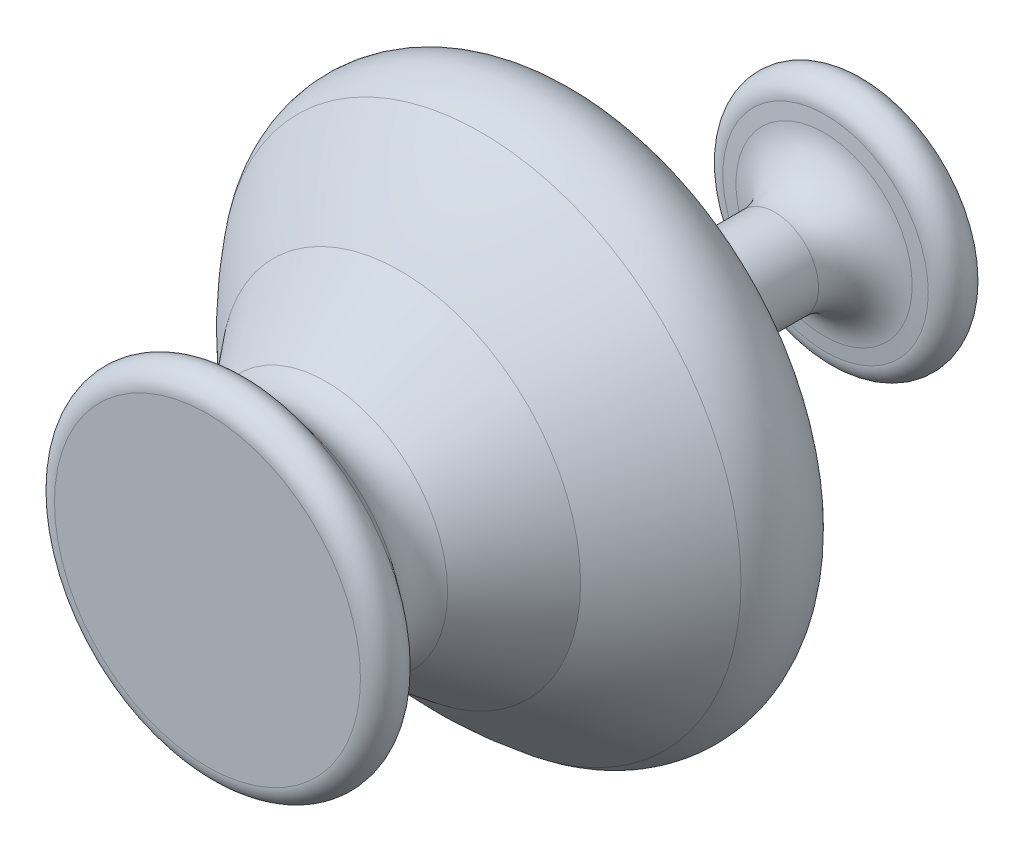
ISO-10303-21;
HEADER;
FILE_DESCRIPTION(('STEP AP214'),'2;1');
FILE_NAME('part.step','',(''),(''),'','','');
FILE_SCHEMA(('AUTOMOTIVE_DESIGN { 1 0 10303 214 1 1 1 1 }'));
ENDSEC;
DATA;
#1=APPLICATION_CONTEXT('core data for automotive mechanical design processes');
#2=APPLICATION_PROTOCOL_DEFINITION('international standard','automotive_design',2000,#1);
#3=PRODUCT_CONTEXT('',#1,'mechanical');
#4=PRODUCT('Part','Part','',(#3));
#5=PRODUCT_RELATED_PRODUCT_CATEGORY('part','',(#4));
#6=PRODUCT_DEFINITION_FORMATION('','',#4);
#7=PRODUCT_DEFINITION_CONTEXT('part definition',#1,'design');
#8=PRODUCT_DEFINITION('design','',#6,#7);
#9=PRODUCT_DEFINITION_SHAPE('','',#8);
#10=(LENGTH_UNIT() NAMED_UNIT(*) SI_UNIT(.MILLI.,.METRE.));
#11=(NAMED_UNIT(*) PLANE_ANGLE_UNIT() SI_UNIT($,.RADIAN.));
#12=(NAMED_UNIT(*) SI_UNIT($,.STERADIAN.) SOLID_ANGLE_UNIT());
#13=UNCERTAINTY_MEASURE_WITH_UNIT(LENGTH_MEASURE(1.E-05),#10,'distance_accuracy_value','');
#14=(GEOMETRIC_REPRESENTATION_CONTEXT(3) GLOBAL_UNCERTAINTY_ASSIGNED_CONTEXT((#13)) GLOBAL_UNIT_ASSIGNED_CONTEXT((#10,
#11,#12)) REPRESENTATION_CONTEXT('',''));
#15=CARTESIAN_POINT('',(0.,0.,0.));
#16=DIRECTION('',(0.,0.,1.));
#17=DIRECTION('',(1.,0.,0.));
#18=AXIS2_PLACEMENT_3D('',#15,#16,#17);
#19=CARTESIAN_POINT('',(0.,0.,-4.4));
#20=DIRECTION('',(0.,0.,1.));
#21=DIRECTION('',(1.,0.,0.));
#22=AXIS2_PLACEMENT_3D('',#19,#20,#21);
#23=PLANE('',#22);
#24=CARTESIAN_POINT('',(0.,0.,-4.4));
#25=DIRECTION('',(0.,0.,1.));
#26=DIRECTION('',(1.,0.,0.));
#27=AXIS2_PLACEMENT_3D('',#24,#25,#26);
#28=CIRCLE('',#27,37.1291959826111);
#29=CARTESIAN_POINT('',(37.1291959826111,0.,-4.4));
#30=VERTEX_POINT('',#29);
#31=EDGE_CURVE('E10',#30,#30,#28,.T.);
#32=ORIENTED_EDGE('',*,*,#31,.F.);
#33=EDGE_LOOP('',(#32));
#34=FACE_BOUND('',#33,.T.);
#35=ADVANCED_FACE('F40',(#34),#23,.F.);
#36=CARTESIAN_POINT('',(0.,0.,-5.));
#37=DIRECTION('',(0.,0.,1.));
#38=DIRECTION('',(1.,0.,0.));
#39=AXIS2_PLACEMENT_3D('',#36,#37,#38);
#40=TOROIDAL_SURFACE('',#39,37.1291959826111,0.599999999999999);
#41=CARTESIAN_POINT('',(0.,0.,-5.47199825214167));
#42=DIRECTION('',(0.,0.,1.));
#43=DIRECTION('',(1.,0.,0.));
#44=AXIS2_PLACEMENT_3D('',#41,#42,#43);
#45=CIRCLE('',#44,37.499624990621);
#46=CARTESIAN_POINT('',(37.499624990621,0.,-5.47199825214167));
#47=VERTEX_POINT('',#46);
#48=EDGE_CURVE('E43',#47,#47,#45,.T.);
#49=ORIENTED_EDGE('',*,*,#48,.F.);
#50=EDGE_LOOP('',(#49));
#51=FACE_BOUND('',#50,.T.);
#52=ORIENTED_EDGE('',*,*,#31,.T.);
#53=EDGE_LOOP('',(#52));
#54=FACE_BOUND('',#53,.T.);
#55=ADVANCED_FACE('F284',(#51,#54),#40,.F.);
#56=CARTESIAN_POINT('',(0.,0.,-5.47199825214167));
#57=DIRECTION('',(0.,0.,1.));
#58=DIRECTION('',(1.,0.,0.));
#59=AXIS2_PLACEMENT_3D('',#56,#57,#58);
#60=CONICAL_SURFACE('',#59,37.499624990621,0.905386373473802);
#61=CARTESIAN_POINT('',(0.,0.,-12.6822443641457));
#62=DIRECTION('',(0.,0.,1.));
#63=DIRECTION('',(1.,0.,0.));
#64=AXIS2_PLACEMENT_3D('',#61,#62,#63);
#65=CIRCLE('',#64,28.3123759124224);
#66=CARTESIAN_POINT('',(28.3123759124224,0.,-12.6822443641457));
#67=VERTEX_POINT('',#66);
#68=EDGE_CURVE('E50',#67,#67,#65,.T.);
#69=ORIENTED_EDGE('',*,*,#68,.F.);
#70=EDGE_LOOP('',(#69));
#71=FACE_BOUND('',#70,.T.);
#72=ORIENTED_EDGE('',*,*,#48,.T.);
#73=EDGE_LOOP('',(#72));
#74=FACE_BOUND('',#73,.T.);
#75=ADVANCED_FACE('F277',(#71,#74),#60,.F.);
#76=CARTESIAN_POINT('',(0.,0.,-23.2235386619763));
#77=DIRECTION('',(0.,0.,1.));
#78=DIRECTION('',(1.,0.,0.));
#79=AXIS2_PLACEMENT_3D('',#76,#77,#78);
#80=TOROIDAL_SURFACE('',#79,36.5852904246438,13.4);
#81=CARTESIAN_POINT('',(0.,0.,-31.4964531741977));
#82=DIRECTION('',(0.,0.,1.));
#83=DIRECTION('',(1.,0.,0.));
#84=AXIS2_PLACEMENT_3D('',#81,#82,#83);
#85=CIRCLE('',#84,26.0439961268133);
#86=CARTESIAN_POINT('',(26.0439961268133,0.,-31.4964531741977));
#87=VERTEX_POINT('',#86);
#88=EDGE_CURVE('E51',#87,#87,#85,.T.);
#89=ORIENTED_EDGE('',*,*,#88,.F.);
#90=EDGE_LOOP('',(#89));
#91=FACE_BOUND('',#90,.T.);
#92=ORIENTED_EDGE('',*,*,#68,.T.);
#93=EDGE_LOOP('',(#92));
#94=FACE_BOUND('',#93,.T.);
#95=ADVANCED_FACE('F275',(#91,#94),#80,.T.);
#96=CARTESIAN_POINT('',(0.,0.,-31.4964531741977));
#97=DIRECTION('',(0.,0.,-1.));
#98=DIRECTION('',(-1.,0.,0.));
#99=AXIS2_PLACEMENT_3D('',#96,#97,#98);
#100=CONICAL_SURFACE('',#99,26.0439961268133,0.665409953321095);
#101=CARTESIAN_POINT('',(0.,0.,-49.974021950315));
#102=DIRECTION('',(0.,0.,1.));
#103=DIRECTION('',(1.,0.,0.));
#104=AXIS2_PLACEMENT_3D('',#101,#102,#103);
#105=CIRCLE('',#104,40.5453792169307);
#106=CARTESIAN_POINT('',(40.5453792169307,0.,-49.974021950315));
#107=VERTEX_POINT('',#106);
#108=EDGE_CURVE('E57',#107,#107,#105,.T.);
#109=ORIENTED_EDGE('',*,*,#108,.F.);
#110=EDGE_LOOP('',(#109));
#111=FACE_BOUND('',#110,.T.);
#112=ORIENTED_EDGE('',*,*,#88,.T.);
#113=EDGE_LOOP('',(#112));
#114=FACE_BOUND('',#113,.T.);
#115=ADVANCED_FACE('F266',(#111,#114),#100,.F.);
#116=CARTESIAN_POINT('',(0.,0.,-143.897984235247));
#117=DIRECTION('',(0.,0.,1.));
#118=DIRECTION('',(1.,0.,0.));
#119=AXIS2_PLACEMENT_3D('',#116,#117,#118);
#120=DEGENERATE_TOROIDAL_SURFACE('',#119,34.7835614944496,120.4,.F.);
#121=CARTESIAN_POINT('',(0.,0.,-69.1516395343863));
#122=DIRECTION('',(0.,0.,1.));
#123=DIRECTION('',(1.,0.,0.));
#124=AXIS2_PLACEMENT_3D('',#121,#122,#123);
#125=CIRCLE('',#124,59.6047002432269);
#126=CARTESIAN_POINT('',(59.6047002432269,0.,-69.1516395343863));
#127=VERTEX_POINT('',#126);
#128=EDGE_CURVE('E56',#127,#127,#125,.T.);
#129=ORIENTED_EDGE('',*,*,#128,.F.);
#130=EDGE_LOOP('',(#129));
#131=FACE_BOUND('',#130,.T.);
#132=ORIENTED_EDGE('',*,*,#108,.T.);
#133=EDGE_LOOP('',(#132));
#134=FACE_BOUND('',#133,.T.);
#135=ADVANCED_FACE('F259',(#131,#134),#120,.T.);
#136=CARTESIAN_POINT('',(0.,0.,-76.3531146052338));
#137=DIRECTION('',(0.,0.,1.));
#138=DIRECTION('',(1.,0.,0.));
#139=AXIS2_PLACEMENT_3D('',#136,#137,#138);
#140=TOROIDAL_SURFACE('',#139,50.5108145608595,11.6000000000002);
#141=CARTESIAN_POINT('',(0.,0.,-86.4819264435769));
#142=DIRECTION('',(0.,0.,1.));
#143=DIRECTION('',(1.,0.,0.));
#144=AXIS2_PLACEMENT_3D('',#141,#142,#143);
#145=CIRCLE('',#144,56.1647663419987);
#146=CARTESIAN_POINT('',(56.1647663419987,0.,-86.4819264435769));
#147=VERTEX_POINT('',#146);
#148=EDGE_CURVE('E64',#147,#147,#145,.T.);
#149=ORIENTED_EDGE('',*,*,#148,.F.);
#150=EDGE_LOOP('',(#149));
#151=FACE_BOUND('',#150,.T.);
#152=ORIENTED_EDGE('',*,*,#128,.T.);
#153=EDGE_LOOP('',(#152));
#154=FACE_BOUND('',#153,.T.);
#155=ADVANCED_FACE('F251',(#151,#154),#140,.F.);
#156=CARTESIAN_POINT('',(0.,0.,-86.4819264435769));
#157=DIRECTION('',(0.,0.,1.));
#158=DIRECTION('',(1.,0.,0.));
#159=AXIS2_PLACEMENT_3D('',#156,#157,#158);
#160=CONICAL_SURFACE('',#159,56.1647663419987,1.06167564707675);
#161=CARTESIAN_POINT('',(0.,0.,-109.679961882164));
#162=DIRECTION('',(0.,0.,1.));
#163=DIRECTION('',(1.,0.,0.));
#164=AXIS2_PLACEMENT_3D('',#161,#162,#163);
#165=CIRCLE('',#164,14.6064819645972);
#166=CARTESIAN_POINT('',(14.6064819645972,0.,-109.679961882164));
#167=VERTEX_POINT('',#166);
#168=EDGE_CURVE('E63',#167,#167,#165,.T.);
#169=CARTESIAN_POINT('',(14.6064819645972,0.,-109.679961882164));
#170=CARTESIAN_POINT('',(15.0393807601951,0.,-109.438315679678));
#171=CARTESIAN_POINT('',(15.472279555793,0.,-109.196669477193));
#172=CARTESIAN_POINT('',(16.3380771469889,0.,-108.713377072222));
#173=CARTESIAN_POINT('',(16.7709759425868,0.,-108.471730869737));
#174=CARTESIAN_POINT('',(17.6367735337827,0.,-107.988438464767));
#175=CARTESIAN_POINT('',(18.0696723293806,0.,-107.746792262281));
#176=CARTESIAN_POINT('',(18.9354699205765,0.,-107.263499857311));
#177=CARTESIAN_POINT('',(19.3683687161744,0.,-107.021853654826));
#178=CARTESIAN_POINT('',(20.2341663073703,0.,-106.538561249855));
#179=CARTESIAN_POINT('',(20.6670651029682,0.,-106.29691504737));
#180=CARTESIAN_POINT('',(21.5328626941641,0.,-105.813622642399));
#181=CARTESIAN_POINT('',(21.965761489762,0.,-105.571976439914));
#182=CARTESIAN_POINT('',(22.8315590809579,0.,-105.088684034943));
#183=CARTESIAN_POINT('',(23.2644578765558,0.,-104.847037832458));
#184=CARTESIAN_POINT('',(24.1302554677517,0.,-104.363745427487));
#185=CARTESIAN_POINT('',(24.5631542633496,0.,-104.122099225002));
#186=CARTESIAN_POINT('',(25.4289518545455,0.,-103.638806820032));
#187=CARTESIAN_POINT('',(25.8618506501434,0.,-103.397160617546));
#188=CARTESIAN_POINT('',(26.7276482413393,0.,-102.913868212576));
#189=CARTESIAN_POINT('',(27.1605470369372,0.,-102.672222010091));
#190=CARTESIAN_POINT('',(28.0263446281331,0.,-102.18892960512));
#191=CARTESIAN_POINT('',(28.459243423731,0.,-101.947283402635));
#192=CARTESIAN_POINT('',(29.3250410149269,0.,-101.463990997664));
#193=CARTESIAN_POINT('',(29.7579398105248,0.,-101.222344795179));
#194=CARTESIAN_POINT('',(30.6237374017207,0.,-100.739052390208));
#195=CARTESIAN_POINT('',(31.0566361973186,0.,-100.497406187723));
#196=CARTESIAN_POINT('',(31.9224337885145,0.,-100.014113782752));
#197=CARTESIAN_POINT('',(32.3553325841124,0.,-99.7724675802672));
#198=CARTESIAN_POINT('',(33.2211301753082,0.,-99.2891751752966));
#199=CARTESIAN_POINT('',(33.6540289709062,0.,-99.0475289728113));
#200=CARTESIAN_POINT('',(34.519826562102,0.,-98.5642365678408));
#201=CARTESIAN_POINT('',(34.9527253577,0.,-98.3225903653555));
#202=CARTESIAN_POINT('',(35.8185229488958,0.,-97.8392979603849));
#203=CARTESIAN_POINT('',(36.2514217444938,0.,-97.5976517578997));
#204=CARTESIAN_POINT('',(37.1172193356896,0.,-97.1143593529291));
#205=CARTESIAN_POINT('',(37.5501181312876,0.,-96.8727131504438));
#206=CARTESIAN_POINT('',(38.4159157224834,0.,-96.3894207454733));
#207=CARTESIAN_POINT('',(38.8488145180814,0.,-96.147774542988));
#208=CARTESIAN_POINT('',(39.7146121092772,0.,-95.6644821380174));
#209=CARTESIAN_POINT('',(40.1475109048752,0.,-95.4228359355322));
#210=CARTESIAN_POINT('',(41.013308496071,0.,-94.9395435305616));
#211=CARTESIAN_POINT('',(41.446207291669,0.,-94.6978973280763));
#212=CARTESIAN_POINT('',(42.3120048828648,0.,-94.2146049231058));
#213=CARTESIAN_POINT('',(42.7449036784628,0.,-93.9729587206205));
#214=CARTESIAN_POINT('',(43.6107012696586,0.,-93.4896663156499));
#215=CARTESIAN_POINT('',(44.0436000652566,0.,-93.2480201131647));
#216=CARTESIAN_POINT('',(44.9093976564524,0.,-92.7647277081941));
#217=CARTESIAN_POINT('',(45.3422964520504,0.,-92.5230815057088));
#218=CARTESIAN_POINT('',(46.2080940432462,0.,-92.0397891007383));
#219=CARTESIAN_POINT('',(46.6409928388441,0.,-91.798142898253));
#220=CARTESIAN_POINT('',(47.50679043004,0.,-91.3148504932824));
#221=CARTESIAN_POINT('',(47.9396892256379,0.,-91.0732042907972));
#222=CARTESIAN_POINT('',(48.8054868168338,0.,-90.5899118858266));
#223=CARTESIAN_POINT('',(49.2383856124317,0.,-90.3482656833413));
#224=CARTESIAN_POINT('',(50.1041832036276,0.,-89.8649732783708));
#225=CARTESIAN_POINT('',(50.5370819992255,0.,-89.6233270758855));
#226=CARTESIAN_POINT('',(51.4028795904214,0.,-89.1400346709149));
#227=CARTESIAN_POINT('',(51.8357783860193,0.,-88.8983884684296));
#228=CARTESIAN_POINT('',(52.7015759772152,0.,-88.4150960634591));
#229=CARTESIAN_POINT('',(53.1344747728131,0.,-88.1734498609738));
#230=CARTESIAN_POINT('',(54.000272364009,0.,-87.6901574560032));
#231=CARTESIAN_POINT('',(54.4331711596069,0.,-87.448511253518));
#232=CARTESIAN_POINT('',(55.2989687508028,0.,-86.9652188485474));
#233=CARTESIAN_POINT('',(55.7318675464007,0.,-86.7235726460621));
#234=CARTESIAN_POINT('',(56.1647663419987,0.,-86.4819264435769));
#235=B_SPLINE_CURVE_WITH_KNOTS('',3,(#169,#170,#171,#172,#173,#174,#175,#176,#177,#178,#179,
#180,#181,#182,#183,#184,#185,#186,#187,#188,#189,#190,#191,#192,#193,#194,#195,#196,#197,#198,
#199,#200,#201,#202,#203,#204,#205,#206,#207,#208,#209,#210,#211,#212,#213,#214,#215,#216,#217,
#218,#219,#220,#221,#222,#223,#224,#225,#226,#227,#228,#229,#230,#231,#232,#233,#234),
.UNSPECIFIED.,.F.,.F.,(4,2,2,2,2,2,2,2,2,2,2,2,2,2,2,2,2,2,2,2,2,2,2,2,2,2,2,2,2,2,2,2,4),(0.,
1.48732924722513,2.97465849445025,4.46198774167538,5.94931698890051,7.43664623612564,
8.92397548335077,10.4113047305759,11.898633977801,13.3859632250262,14.8732924722513,
16.3606217194764,17.8479509667015,19.3352802139267,20.8226094611518,22.3099387083769,
23.7972679556021,25.2845972028272,26.7719264500523,28.2592556972774,29.7465849445026,
31.2339141917277,32.7212434389528,34.208572686178,35.6959019334031,37.1832311806282,
38.6705604278534,40.1578896750785,41.6452189223036,43.1325481695287,44.6198774167539,
46.107206663979,47.5945359112041),.UNSPECIFIED.);
#236=EDGE_CURVE('BSEAM246',#167,#147,#235,.T.);
#237=ORIENTED_EDGE('',*,*,#168,.F.);
#238=ORIENTED_EDGE('',*,*,#148,.T.);
#239=ORIENTED_EDGE('',*,*,#236,.T.);
#240=ORIENTED_EDGE('',*,*,#236,.F.);
#241=EDGE_LOOP('',(#237,#239,#238,#240));
#242=FACE_BOUND('',#241,.T.);
#243=ADVANCED_FACE('F246',(#242),#160,.F.);
#244=CARTESIAN_POINT('',(0.,0.,-124.000006205338));
#245=DIRECTION('',(0.,0.,1.));
#246=DIRECTION('',(1.,0.,0.));
#247=AXIS2_PLACEMENT_3D('',#244,#245,#246);
#248=TOROIDAL_SURFACE('',#247,22.6,16.4);
#249=CARTESIAN_POINT('',(0.,0.,-124.000006205338));
#250=DIRECTION('',(0.,0.,1.));
#251=DIRECTION('',(1.,0.,0.));
#252=AXIS2_PLACEMENT_3D('',#249,#250,#251);
#253=CIRCLE('',#252,6.2);
#254=CARTESIAN_POINT('',(6.2,0.,-124.000006205338));
#255=VERTEX_POINT('',#254);
#256=EDGE_CURVE('E66',#255,#255,#253,.T.);
#257=ORIENTED_EDGE('',*,*,#256,.F.);
#258=EDGE_LOOP('',(#257));
#259=FACE_BOUND('',#258,.T.);
#260=ORIENTED_EDGE('',*,*,#168,.T.);
#261=EDGE_LOOP('',(#260));
#262=FACE_BOUND('',#261,.T.);
#263=ADVANCED_FACE('F244',(#259,#262),#248,.T.);
#264=CARTESIAN_POINT('',(0.,0.,0.));
#265=DIRECTION('',(0.,0.,1.));
#266=DIRECTION('',(1.,0.,0.));
#267=AXIS2_PLACEMENT_3D('',#264,#265,#266);
#268=CYLINDRICAL_SURFACE('',#267,6.2);
#269=CARTESIAN_POINT('',(0.,0.,-137.700006205338));
#270=DIRECTION('',(0.,0.,1.));
#271=DIRECTION('',(1.,0.,0.));
#272=AXIS2_PLACEMENT_3D('',#269,#270,#271);
#273=CIRCLE('',#272,6.2);
#274=CARTESIAN_POINT('',(6.2,0.,-137.700006205338));
#275=VERTEX_POINT('',#274);
#276=EDGE_CURVE('E72',#275,#275,#273,.T.);
#277=ORIENTED_EDGE('',*,*,#276,.F.);
#278=EDGE_LOOP('',(#277));
#279=FACE_BOUND('',#278,.T.);
#280=ORIENTED_EDGE('',*,*,#256,.T.);
#281=EDGE_LOOP('',(#280));
#282=FACE_BOUND('',#281,.T.);
#283=ADVANCED_FACE('F237',(#279,#282),#268,.F.);
#284=CARTESIAN_POINT('',(0.,0.,-137.700006205338));
#285=DIRECTION('',(0.,0.,1.));
#286=DIRECTION('',(1.,0.,0.));
#287=AXIS2_PLACEMENT_3D('',#284,#285,#286);
#288=TOROIDAL_SURFACE('',#287,22.6,16.4);
#289=CARTESIAN_POINT('',(0.,0.,-154.015025771309));
#290=DIRECTION('',(0.,0.,1.));
#291=DIRECTION('',(1.,0.,0.));
#292=AXIS2_PLACEMENT_3D('',#289,#290,#291);
#293=CIRCLE('',#292,20.9326258482262);
#294=CARTESIAN_POINT('',(20.9326258482262,0.,-154.015025771309));
#295=VERTEX_POINT('',#294);
#296=EDGE_CURVE('E71',#295,#295,#293,.T.);
#297=ORIENTED_EDGE('',*,*,#296,.F.);
#298=EDGE_LOOP('',(#297));
#299=FACE_BOUND('',#298,.T.);
#300=ORIENTED_EDGE('',*,*,#276,.T.);
#301=EDGE_LOOP('',(#300));
#302=FACE_BOUND('',#301,.T.);
#303=ADVANCED_FACE('F229',(#299,#302),#288,.T.);
#304=CARTESIAN_POINT('',(0.,0.,-154.015025771309));
#305=DIRECTION('',(0.,0.,-1.));
#306=DIRECTION('',(-1.,0.,0.));
#307=AXIS2_PLACEMENT_3D('',#304,#305,#306);
#308=CONICAL_SURFACE('',#307,20.9326258482262,1.46895119890913);
#309=CARTESIAN_POINT('',(0.,0.,-154.411151253805));
#310=DIRECTION('',(0.,0.,1.));
#311=DIRECTION('',(1.,0.,0.));
#312=AXIS2_PLACEMENT_3D('',#309,#310,#311);
#313=CIRCLE('',#312,24.8086575059394);
#314=CARTESIAN_POINT('',(24.8086575059394,0.,-154.411151253805));
#315=VERTEX_POINT('',#314);
#316=EDGE_CURVE('E77',#315,#315,#313,.T.);
#317=ORIENTED_EDGE('',*,*,#316,.F.);
#318=EDGE_LOOP('',(#317));
#319=FACE_BOUND('',#318,.T.);
#320=ORIENTED_EDGE('',*,*,#296,.T.);
#321=EDGE_LOOP('',(#320));
#322=FACE_BOUND('',#321,.T.);
#323=ADVANCED_FACE('F222',(#319,#322),#308,.F.);
#324=CARTESIAN_POINT('',(0.,0.,-155.));
#325=DIRECTION('',(0.,0.,1.));
#326=DIRECTION('',(1.,0.,0.));
#327=AXIS2_PLACEMENT_3D('',#324,#325,#326);
#328=TOROIDAL_SURFACE('',#327,24.9237972215466,0.600000000004467);
#329=CARTESIAN_POINT('',(0.,0.,-155.600000000005));
#330=DIRECTION('',(0.,0.,1.));
#331=DIRECTION('',(1.,0.,0.));
#332=AXIS2_PLACEMENT_3D('',#329,#330,#331);
#333=CIRCLE('',#332,24.9237963036634);
#334=CARTESIAN_POINT('',(24.9237963036634,0.,-155.600000000005));
#335=VERTEX_POINT('',#334);
#336=EDGE_CURVE('E79',#335,#335,#333,.T.);
#337=ORIENTED_EDGE('',*,*,#336,.F.);
#338=EDGE_LOOP('',(#337));
#339=FACE_BOUND('',#338,.T.);
#340=ORIENTED_EDGE('',*,*,#316,.T.);
#341=EDGE_LOOP('',(#340));
#342=FACE_BOUND('',#341,.T.);
#343=ADVANCED_FACE('F216',(#339,#342),#328,.F.);
#344=CARTESIAN_POINT('',(-24.9237963036634,0.,-155.600000000003));
#345=DIRECTION('',(0.,0.,-1.));
#346=DIRECTION('',(-1.,0.,0.));
#347=AXIS2_PLACEMENT_3D('',#344,#345,#346);
#348=PLANE('',#347);
#349=CARTESIAN_POINT('',(0.,0.,-155.6));
#350=DIRECTION('',(0.,0.,1.));
#351=DIRECTION('',(1.,0.,0.));
#352=AXIS2_PLACEMENT_3D('',#349,#350,#351);
#353=CIRCLE('',#352,14.4237972215498);
#354=CARTESIAN_POINT('',(14.4237972215498,0.,-155.6));
#355=VERTEX_POINT('',#354);
#356=EDGE_CURVE('E81',#355,#355,#353,.T.);
#357=ORIENTED_EDGE('',*,*,#356,.F.);
#358=EDGE_LOOP('',(#357));
#359=FACE_BOUND('',#358,.T.);
#360=ORIENTED_EDGE('',*,*,#336,.T.);
#361=EDGE_LOOP('',(#360));
#362=FACE_BOUND('',#361,.T.);
#363=ADVANCED_FACE('F212',(#359,#362),#348,.F.);
#364=CARTESIAN_POINT('',(0.,0.,0.));
#365=DIRECTION('',(0.,0.,1.));
#366=DIRECTION('',(1.,0.,0.));
#367=AXIS2_PLACEMENT_3D('',#364,#365,#366);
#368=CYLINDRICAL_SURFACE('',#367,14.4237972215498);
#369=CARTESIAN_POINT('',(0.,0.,-160.));
#370=DIRECTION('',(0.,0.,1.));
#371=DIRECTION('',(1.,0.,0.));
#372=AXIS2_PLACEMENT_3D('',#369,#370,#371);
#373=CIRCLE('',#372,14.4237972215498);
#374=CARTESIAN_POINT('',(14.4237972215498,0.,-160.));
#375=VERTEX_POINT('',#374);
#376=EDGE_CURVE('E86',#375,#375,#373,.T.);
#377=ORIENTED_EDGE('',*,*,#376,.F.);
#378=EDGE_LOOP('',(#377));
#379=FACE_BOUND('',#378,.T.);
#380=ORIENTED_EDGE('',*,*,#356,.T.);
#381=EDGE_LOOP('',(#380));
#382=FACE_BOUND('',#381,.T.);
#383=ADVANCED_FACE('F207',(#379,#382),#368,.F.);
#384=CARTESIAN_POINT('',(-24.9237895725271,0.,-159.999999999999));
#385=DIRECTION('',(0.,0.,1.));
#386=DIRECTION('',(1.,0.,0.));
#387=AXIS2_PLACEMENT_3D('',#384,#385,#386);
#388=PLANE('',#387);
#389=CARTESIAN_POINT('',(0.,0.,-159.999999999999));
#390=DIRECTION('',(0.,0.,1.));
#391=DIRECTION('',(1.,0.,0.));
#392=AXIS2_PLACEMENT_3D('',#389,#390,#391);
#393=CIRCLE('',#392,24.9237895725271);
#394=CARTESIAN_POINT('',(24.9237895725271,0.,-159.999999999999));
#395=VERTEX_POINT('',#394);
#396=EDGE_CURVE('E87',#395,#395,#393,.T.);
#397=ORIENTED_EDGE('',*,*,#396,.F.);
#398=EDGE_LOOP('',(#397));
#399=FACE_BOUND('',#398,.T.);
#400=ORIENTED_EDGE('',*,*,#376,.T.);
#401=EDGE_LOOP('',(#400));
#402=FACE_BOUND('',#401,.T.);
#403=ADVANCED_FACE('F198',(#399,#402),#388,.F.);
#404=CARTESIAN_POINT('',(0.,0.,-155.));
#405=DIRECTION('',(0.,0.,1.));
#406=DIRECTION('',(1.,0.,0.));
#407=AXIS2_PLACEMENT_3D('',#404,#405,#406);
#408=TOROIDAL_SURFACE('',#407,24.9237972215466,5.00000000000453);
#409=CARTESIAN_POINT('',(0.,0.,-149.999999999997));
#410=DIRECTION('',(0.,0.,1.));
#411=DIRECTION('',(1.,0.,0.));
#412=AXIS2_PLACEMENT_3D('',#409,#410,#411);
#413=CIRCLE('',#412,24.9237972215444);
#414=CARTESIAN_POINT('',(24.9237972215444,0.,-149.999999999997));
#415=VERTEX_POINT('',#414);
#416=EDGE_CURVE('E95',#415,#415,#413,.T.);
#417=ORIENTED_EDGE('',*,*,#416,.F.);
#418=EDGE_LOOP('',(#417));
#419=FACE_BOUND('',#418,.T.);
#420=ORIENTED_EDGE('',*,*,#396,.T.);
#421=EDGE_LOOP('',(#420));
#422=FACE_BOUND('',#421,.T.);
#423=ADVANCED_FACE('F191',(#419,#422),#408,.T.);
#424=CARTESIAN_POINT('',(0.,0.,-149.999999999997));
#425=DIRECTION('',(0.,0.,-1.));
#426=DIRECTION('',(-1.,0.,0.));
#427=AXIS2_PLACEMENT_3D('',#424,#425,#426);
#428=CONICAL_SURFACE('',#427,24.9237972215444,1.46895119890884);
#429=CARTESIAN_POINT('',(0.,0.,-149.637825399951));
#430=DIRECTION('',(0.,0.,1.));
#431=DIRECTION('',(1.,0.,0.));
#432=AXIS2_PLACEMENT_3D('',#429,#430,#431);
#433=CIRCLE('',#432,21.3799701328484);
#434=CARTESIAN_POINT('',(21.3799701328484,0.,-149.637825399951));
#435=VERTEX_POINT('',#434);
#436=EDGE_CURVE('E94',#435,#435,#433,.T.);
#437=ORIENTED_EDGE('',*,*,#436,.F.);
#438=EDGE_LOOP('',(#437));
#439=FACE_BOUND('',#438,.T.);
#440=ORIENTED_EDGE('',*,*,#416,.T.);
#441=EDGE_LOOP('',(#440));
#442=FACE_BOUND('',#441,.T.);
#443=ADVANCED_FACE('F187',(#439,#442),#428,.T.);
#444=CARTESIAN_POINT('',(0.,0.,-137.700006205338));
#445=DIRECTION('',(0.,0.,1.));
#446=DIRECTION('',(1.,0.,0.));
#447=AXIS2_PLACEMENT_3D('',#444,#445,#446);
#448=TOROIDAL_SURFACE('',#447,22.6,12.);
#449=CARTESIAN_POINT('',(0.,0.,-137.700006205338));
#450=DIRECTION('',(0.,0.,1.));
#451=DIRECTION('',(1.,0.,0.));
#452=AXIS2_PLACEMENT_3D('',#449,#450,#451);
#453=CIRCLE('',#452,10.6);
#454=CARTESIAN_POINT('',(10.6,0.,-137.700006205338));
#455=VERTEX_POINT('',#454);
#456=EDGE_CURVE('E97',#455,#455,#453,.T.);
#457=ORIENTED_EDGE('',*,*,#456,.F.);
#458=EDGE_LOOP('',(#457));
#459=FACE_BOUND('',#458,.T.);
#460=ORIENTED_EDGE('',*,*,#436,.T.);
#461=EDGE_LOOP('',(#460));
#462=FACE_BOUND('',#461,.T.);
#463=ADVANCED_FACE('F185',(#459,#462),#448,.F.);
#464=CARTESIAN_POINT('',(0.,0.,0.));
#465=DIRECTION('',(0.,0.,1.));
#466=DIRECTION('',(1.,0.,0.));
#467=AXIS2_PLACEMENT_3D('',#464,#465,#466);
#468=CYLINDRICAL_SURFACE('',#467,10.6);
#469=CARTESIAN_POINT('',(0.,0.,-124.000006205338));
#470=DIRECTION('',(0.,0.,1.));
#471=DIRECTION('',(1.,0.,0.));
#472=AXIS2_PLACEMENT_3D('',#469,#470,#471);
#473=CIRCLE('',#472,10.6);
#474=CARTESIAN_POINT('',(10.6,0.,-124.000006205338));
#475=VERTEX_POINT('',#474);
#476=EDGE_CURVE('E102',#475,#475,#473,.T.);
#477=ORIENTED_EDGE('',*,*,#476,.F.);
#478=EDGE_LOOP('',(#477));
#479=FACE_BOUND('',#478,.T.);
#480=ORIENTED_EDGE('',*,*,#456,.T.);
#481=EDGE_LOOP('',(#480));
#482=FACE_BOUND('',#481,.T.);
#483=ADVANCED_FACE('F176',(#479,#482),#468,.T.);
#484=CARTESIAN_POINT('',(0.,0.,-124.000006205338));
#485=DIRECTION('',(0.,0.,1.));
#486=DIRECTION('',(1.,0.,0.));
#487=AXIS2_PLACEMENT_3D('',#484,#485,#486);
#488=TOROIDAL_SURFACE('',#487,22.6,12.);
#489=CARTESIAN_POINT('',(0.,0.,-113.521924993259));
#490=DIRECTION('',(0.,0.,1.));
#491=DIRECTION('',(1.,0.,0.));
#492=AXIS2_PLACEMENT_3D('',#489,#490,#491);
#493=CIRCLE('',#492,16.7510843643394);
#494=CARTESIAN_POINT('',(16.7510843643394,0.,-113.521924993259));
#495=VERTEX_POINT('',#494);
#496=EDGE_CURVE('E101',#495,#495,#493,.T.);
#497=ORIENTED_EDGE('',*,*,#496,.F.);
#498=EDGE_LOOP('',(#497));
#499=FACE_BOUND('',#498,.T.);
#500=ORIENTED_EDGE('',*,*,#476,.T.);
#501=EDGE_LOOP('',(#500));
#502=FACE_BOUND('',#501,.T.);
#503=ADVANCED_FACE('F169',(#499,#502),#488,.F.);
#504=CARTESIAN_POINT('',(0.,0.,-113.521924993259));
#505=DIRECTION('',(0.,0.,1.));
#506=DIRECTION('',(1.,0.,0.));
#507=AXIS2_PLACEMENT_3D('',#504,#505,#506);
#508=CONICAL_SURFACE('',#507,16.7510843643394,1.06167564707674);
#509=CARTESIAN_POINT('',(0.,0.,-90.3238895546722));
#510=DIRECTION('',(0.,0.,1.));
#511=DIRECTION('',(1.,0.,0.));
#512=AXIS2_PLACEMENT_3D('',#509,#510,#511);
#513=CIRCLE('',#512,58.3093687417409);
#514=CARTESIAN_POINT('',(58.3093687417409,0.,-90.3238895546722));
#515=VERTEX_POINT('',#514);
#516=EDGE_CURVE('E109',#515,#515,#513,.T.);
#517=CARTESIAN_POINT('',(58.3093687417409,0.,-90.3238895546722));
#518=CARTESIAN_POINT('',(57.876469946143,0.,-90.5655357571575));
#519=CARTESIAN_POINT('',(57.443571150545,0.,-90.8071819596428));
#520=CARTESIAN_POINT('',(56.5777735593492,0.,-91.2904743646134));
#521=CARTESIAN_POINT('',(56.1448747637512,0.,-91.5321205670987));
#522=CARTESIAN_POINT('',(55.2790771725554,0.,-92.0154129720692));
#523=CARTESIAN_POINT('',(54.8461783769574,0.,-92.2570591745545));
#524=CARTESIAN_POINT('',(53.9803807857616,0.,-92.7403515795251));
#525=CARTESIAN_POINT('',(53.5474819901636,0.,-92.9819977820103));
#526=CARTESIAN_POINT('',(52.6816843989678,0.,-93.4652901869809));
#527=CARTESIAN_POINT('',(52.2487856033698,0.,-93.7069363894662));
#528=CARTESIAN_POINT('',(51.382988012174,0.,-94.1902287944367));
#529=CARTESIAN_POINT('',(50.950089216576,0.,-94.431874996922));
#530=CARTESIAN_POINT('',(50.0842916253802,0.,-94.9151674018926));
#531=CARTESIAN_POINT('',(49.6513928297822,0.,-95.1568136043779));
#532=CARTESIAN_POINT('',(48.7855952385864,0.,-95.6401060093484));
#533=CARTESIAN_POINT('',(48.3526964429884,0.,-95.8817522118337));
#534=CARTESIAN_POINT('',(47.4868988517926,0.,-96.3650446168043));
#535=CARTESIAN_POINT('',(47.0540000561947,0.,-96.6066908192896));
#536=CARTESIAN_POINT('',(46.1882024649988,0.,-97.0899832242601));
#537=CARTESIAN_POINT('',(45.7553036694009,0.,-97.3316294267454));
#538=CARTESIAN_POINT('',(44.889506078205,0.,-97.814921831716));
#539=CARTESIAN_POINT('',(44.4566072826071,0.,-98.0565680342012));
#540=CARTESIAN_POINT('',(43.5908096914112,0.,-98.5398604391718));
#541=CARTESIAN_POINT('',(43.1579108958133,0.,-98.7815066416571));
#542=CARTESIAN_POINT('',(42.2921133046174,0.,-99.2647990466276));
#543=CARTESIAN_POINT('',(41.8592145090195,0.,-99.5064452491129));
#544=CARTESIAN_POINT('',(40.9934169178236,0.,-99.9897376540835));
#545=CARTESIAN_POINT('',(40.5605181222257,0.,-100.231383856569));
#546=CARTESIAN_POINT('',(39.6947205310298,0.,-100.714676261539));
#547=CARTESIAN_POINT('',(39.2618217354319,0.,-100.956322464025));
#548=CARTESIAN_POINT('',(38.396024144236,0.,-101.439614868995));
#549=CARTESIAN_POINT('',(37.9631253486381,0.,-101.68126107148));
#550=CARTESIAN_POINT('',(37.0973277574422,0.,-102.164553476451));
#551=CARTESIAN_POINT('',(36.6644289618443,0.,-102.406199678936));
#552=CARTESIAN_POINT('',(35.7986313706484,0.,-102.889492083907));
#553=CARTESIAN_POINT('',(35.3657325750505,0.,-103.131138286392));
#554=CARTESIAN_POINT('',(34.4999349838546,0.,-103.614430691363));
#555=CARTESIAN_POINT('',(34.0670361882567,0.,-103.856076893848));
#556=CARTESIAN_POINT('',(33.2012385970608,0.,-104.339369298819));
#557=CARTESIAN_POINT('',(32.7683398014629,0.,-104.581015501304));
#558=CARTESIAN_POINT('',(31.902542210267,0.,-105.064307906274));
#559=CARTESIAN_POINT('',(31.4696434146691,0.,-105.30595410876));
#560=CARTESIAN_POINT('',(30.6038458234732,0.,-105.78924651373));
#561=CARTESIAN_POINT('',(30.1709470278753,0.,-106.030892716216));
#562=CARTESIAN_POINT('',(29.3051494366794,0.,-106.514185121186));
#563=CARTESIAN_POINT('',(28.8722506410815,0.,-106.755831323671));
#564=CARTESIAN_POINT('',(28.0064530498856,0.,-107.239123728642));
#565=CARTESIAN_POINT('',(27.5735542542877,0.,-107.480769931127));
#566=CARTESIAN_POINT('',(26.7077566630918,0.,-107.964062336098));
#567=CARTESIAN_POINT('',(26.2748578674939,0.,-108.205708538583));
#568=CARTESIAN_POINT('',(25.409060276298,0.,-108.689000943554));
#569=CARTESIAN_POINT('',(24.9761614807001,0.,-108.930647146039));
#570=CARTESIAN_POINT('',(24.1103638895042,0.,-109.413939551009));
#571=CARTESIAN_POINT('',(23.6774650939063,0.,-109.655585753495));
#572=CARTESIAN_POINT('',(22.8116675027104,0.,-110.138878158465));
#573=CARTESIAN_POINT('',(22.3787687071125,0.,-110.380524360951));
#574=CARTESIAN_POINT('',(21.5129711159166,0.,-110.863816765921));
#575=CARTESIAN_POINT('',(21.0800723203187,0.,-111.105462968406));
#576=CARTESIAN_POINT('',(20.2142747291228,0.,-111.588755373377));
#577=CARTESIAN_POINT('',(19.7813759335249,0.,-111.830401575862));
#578=CARTESIAN_POINT('',(18.9155783423291,0.,-112.313693980833));
#579=CARTESIAN_POINT('',(18.4826795467311,0.,-112.555340183318));
#580=CARTESIAN_POINT('',(17.6168819555353,0.,-113.038632588289));
#581=CARTESIAN_POINT('',(17.1839831599373,0.,-113.280278790774));
#582=CARTESIAN_POINT('',(16.7510843643394,0.,-113.521924993259));
#583=B_SPLINE_CURVE_WITH_KNOTS('',3,(#517,#518,#519,#520,#521,#522,#523,#524,#525,#526,#527,
#528,#529,#530,#531,#532,#533,#534,#535,#536,#537,#538,#539,#540,#541,#542,#543,#544,#545,#546,
#547,#548,#549,#550,#551,#552,#553,#554,#555,#556,#557,#558,#559,#560,#561,#562,#563,#564,#565,
#566,#567,#568,#569,#570,#571,#572,#573,#574,#575,#576,#577,#578,#579,#580,#581,#582),
.UNSPECIFIED.,.F.,.F.,(4,2,2,2,2,2,2,2,2,2,2,2,2,2,2,2,2,2,2,2,2,2,2,2,2,2,2,2,2,2,2,2,4),(0.,
1.48732924722513,2.97465849445026,4.4619877416754,5.94931698890053,7.43664623612566,
8.92397548335079,10.4113047305759,11.8986339778011,13.3859632250262,14.8732924722513,
16.3606217194765,17.8479509667016,19.3352802139267,20.8226094611519,22.309938708377,
23.7972679556021,25.2845972028273,26.7719264500524,28.2592556972775,29.7465849445027,
31.2339141917278,32.7212434389529,34.2085726861781,35.6959019334032,37.1832311806283,
38.6705604278535,40.1578896750786,41.6452189223037,43.1325481695289,44.619877416754,
46.1072066639791,47.5945359112043),.UNSPECIFIED.);
#584=EDGE_CURVE('BSEAM161',#515,#495,#583,.T.);
#585=ORIENTED_EDGE('',*,*,#516,.F.);
#586=ORIENTED_EDGE('',*,*,#496,.T.);
#587=ORIENTED_EDGE('',*,*,#584,.T.);
#588=ORIENTED_EDGE('',*,*,#584,.F.);
#589=EDGE_LOOP('',(#585,#587,#586,#588));
#590=FACE_BOUND('',#589,.T.);
#591=ADVANCED_FACE('F161',(#590),#508,.T.);
#592=CARTESIAN_POINT('',(0.,0.,-76.3531146052338));
#593=DIRECTION('',(0.,0.,1.));
#594=DIRECTION('',(1.,0.,0.));
#595=AXIS2_PLACEMENT_3D('',#592,#593,#594);
#596=TOROIDAL_SURFACE('',#595,50.5108145608595,16.);
#597=CARTESIAN_POINT('',(0.,0.,-66.4200455419958));
#598=DIRECTION('',(0.,0.,1.));
#599=DIRECTION('',(1.,0.,0.));
#600=AXIS2_PLACEMENT_3D('',#597,#598,#599);
#601=CIRCLE('',#600,63.0541051572282);
#602=CARTESIAN_POINT('',(63.0541051572282,0.,-66.4200455419958));
#603=VERTEX_POINT('',#602);
#604=EDGE_CURVE('E108',#603,#603,#601,.T.);
#605=ORIENTED_EDGE('',*,*,#604,.F.);
#606=EDGE_LOOP('',(#605));
#607=FACE_BOUND('',#606,.T.);
#608=ORIENTED_EDGE('',*,*,#516,.T.);
#609=EDGE_LOOP('',(#608));
#610=FACE_BOUND('',#609,.T.);
#611=ADVANCED_FACE('F156',(#607,#610),#596,.T.);
#612=CARTESIAN_POINT('',(0.,0.,-143.897984235249));
#613=DIRECTION('',(0.,0.,1.));
#614=DIRECTION('',(1.,0.,0.));
#615=AXIS2_PLACEMENT_3D('',#612,#613,#614);
#616=DEGENERATE_TOROIDAL_SURFACE('',#615,34.783561494449,124.800000000001,.F.);
#617=CARTESIAN_POINT('',(0.,0.,-46.8623781234862));
#618=DIRECTION('',(0.,0.,1.));
#619=DIRECTION('',(1.,0.,0.));
#620=AXIS2_PLACEMENT_3D('',#617,#618,#619);
#621=CIRCLE('',#620,43.6965706825745);
#622=CARTESIAN_POINT('',(43.6965706825745,0.,-46.8623781234862));
#623=VERTEX_POINT('',#622);
#624=EDGE_CURVE('E111',#623,#623,#621,.T.);
#625=ORIENTED_EDGE('',*,*,#624,.F.);
#626=EDGE_LOOP('',(#625));
#627=FACE_BOUND('',#626,.T.);
#628=ORIENTED_EDGE('',*,*,#604,.T.);
#629=EDGE_LOOP('',(#628));
#630=FACE_BOUND('',#629,.T.);
#631=ADVANCED_FACE('F154',(#627,#630),#616,.F.);
#632=CARTESIAN_POINT('',(0.,0.,-46.8623781234862));
#633=DIRECTION('',(0.,0.,-1.));
#634=DIRECTION('',(-1.,0.,0.));
#635=AXIS2_PLACEMENT_3D('',#632,#633,#634);
#636=CONICAL_SURFACE('',#635,43.6965706825745,0.665409953321094);
#637=CARTESIAN_POINT('',(0.,0.,-28.779973782125));
#638=DIRECTION('',(0.,0.,1.));
#639=DIRECTION('',(1.,0.,0.));
#640=AXIS2_PLACEMENT_3D('',#637,#638,#639);
#641=CIRCLE('',#640,29.5053166425188);
#642=CARTESIAN_POINT('',(29.5053166425188,0.,-28.779973782125));
#643=VERTEX_POINT('',#642);
#644=EDGE_CURVE('E117',#643,#643,#641,.T.);
#645=ORIENTED_EDGE('',*,*,#644,.F.);
#646=EDGE_LOOP('',(#645));
#647=FACE_BOUND('',#646,.T.);
#648=ORIENTED_EDGE('',*,*,#624,.T.);
#649=EDGE_LOOP('',(#648));
#650=FACE_BOUND('',#649,.T.);
#651=ADVANCED_FACE('F147',(#647,#650),#636,.T.);
#652=CARTESIAN_POINT('',(0.,0.,-23.2235386619763));
#653=DIRECTION('',(0.,0.,1.));
#654=DIRECTION('',(1.,0.,0.));
#655=AXIS2_PLACEMENT_3D('',#652,#653,#654);
#656=TOROIDAL_SURFACE('',#655,36.5852904246438,8.99999999999999);
#657=CARTESIAN_POINT('',(0.,0.,-16.1435648798513));
#658=DIRECTION('',(0.,0.,1.));
#659=DIRECTION('',(1.,0.,0.));
#660=AXIS2_PLACEMENT_3D('',#657,#658,#659);
#661=CIRCLE('',#660,31.0288553044951);
#662=CARTESIAN_POINT('',(31.0288553044951,0.,-16.1435648798513));
#663=VERTEX_POINT('',#662);
#664=EDGE_CURVE('E116',#663,#663,#661,.T.);
#665=ORIENTED_EDGE('',*,*,#664,.F.);
#666=EDGE_LOOP('',(#665));
#667=FACE_BOUND('',#666,.T.);
#668=ORIENTED_EDGE('',*,*,#644,.T.);
#669=EDGE_LOOP('',(#668));
#670=FACE_BOUND('',#669,.T.);
#671=ADVANCED_FACE('F139',(#667,#670),#656,.F.);
#672=CARTESIAN_POINT('',(0.,0.,-16.1435648798513));
#673=DIRECTION('',(0.,0.,1.));
#674=DIRECTION('',(1.,0.,0.));
#675=AXIS2_PLACEMENT_3D('',#672,#673,#674);
#676=CONICAL_SURFACE('',#675,31.0288553044951,0.905386373473803);
#677=CARTESIAN_POINT('',(0.,0.,-8.93331876784722));
#678=DIRECTION('',(0.,0.,1.));
#679=DIRECTION('',(1.,0.,0.));
#680=AXIS2_PLACEMENT_3D('',#677,#678,#679);
#681=CIRCLE('',#680,40.2161043826938);
#682=CARTESIAN_POINT('',(40.2161043826938,0.,-8.93331876784722));
#683=VERTEX_POINT('',#682);
#684=EDGE_CURVE('E122',#683,#683,#681,.T.);
#685=ORIENTED_EDGE('',*,*,#684,.F.);
#686=EDGE_LOOP('',(#685));
#687=FACE_BOUND('',#686,.T.);
#688=ORIENTED_EDGE('',*,*,#664,.T.);
#689=EDGE_LOOP('',(#688));
#690=FACE_BOUND('',#689,.T.);
#691=ADVANCED_FACE('F132',(#687,#690),#676,.T.);
#692=CARTESIAN_POINT('',(0.,0.,-5.));
#693=DIRECTION('',(0.,0.,1.));
#694=DIRECTION('',(1.,0.,0.));
#695=AXIS2_PLACEMENT_3D('',#692,#693,#694);
#696=TOROIDAL_SURFACE('',#695,37.1291959826111,5.);
#697=CARTESIAN_POINT('',(0.,0.,0.));
#698=DIRECTION('',(0.,0.,1.));
#699=DIRECTION('',(1.,0.,0.));
#700=AXIS2_PLACEMENT_3D('',#697,#698,#699);
#701=CIRCLE('',#700,37.1291959826111);
#702=CARTESIAN_POINT('',(37.1291959826111,0.,0.));
#703=VERTEX_POINT('',#702);
#704=EDGE_CURVE('E124',#703,#703,#701,.T.);
#705=ORIENTED_EDGE('',*,*,#704,.F.);
#706=EDGE_LOOP('',(#705));
#707=FACE_BOUND('',#706,.T.);
#708=ORIENTED_EDGE('',*,*,#684,.T.);
#709=EDGE_LOOP('',(#708));
#710=FACE_BOUND('',#709,.T.);
#711=ADVANCED_FACE('F131',(#707,#710),#696,.T.);
#712=CARTESIAN_POINT('',(0.,0.,0.));
#713=DIRECTION('',(0.,0.,-1.));
#714=DIRECTION('',(-1.,0.,0.));
#715=AXIS2_PLACEMENT_3D('',#712,#713,#714);
#716=PLANE('',#715);
#717=ORIENTED_EDGE('',*,*,#704,.T.);
#718=EDGE_LOOP('',(#717));
#719=FACE_BOUND('',#718,.T.);
#720=ADVANCED_FACE('F129',(#719),#716,.F.);
#721=CLOSED_SHELL('',(#35,#55,#75,#95,#115,#135,#155,#243,#263,#283,#303,#323,#343,#363,#383,
#403,#423,#443,#463,#483,#503,#591,#611,#631,#651,#671,#691,#711,#720));
#722=MANIFOLD_SOLID_BREP('B2',#721);
#723=ADVANCED_BREP_SHAPE_REPRESENTATION('',(#18,#722),#14);
#724=SHAPE_DEFINITION_REPRESENTATION(#9,#723);
ENDSEC;
END-ISO-10303-21;
